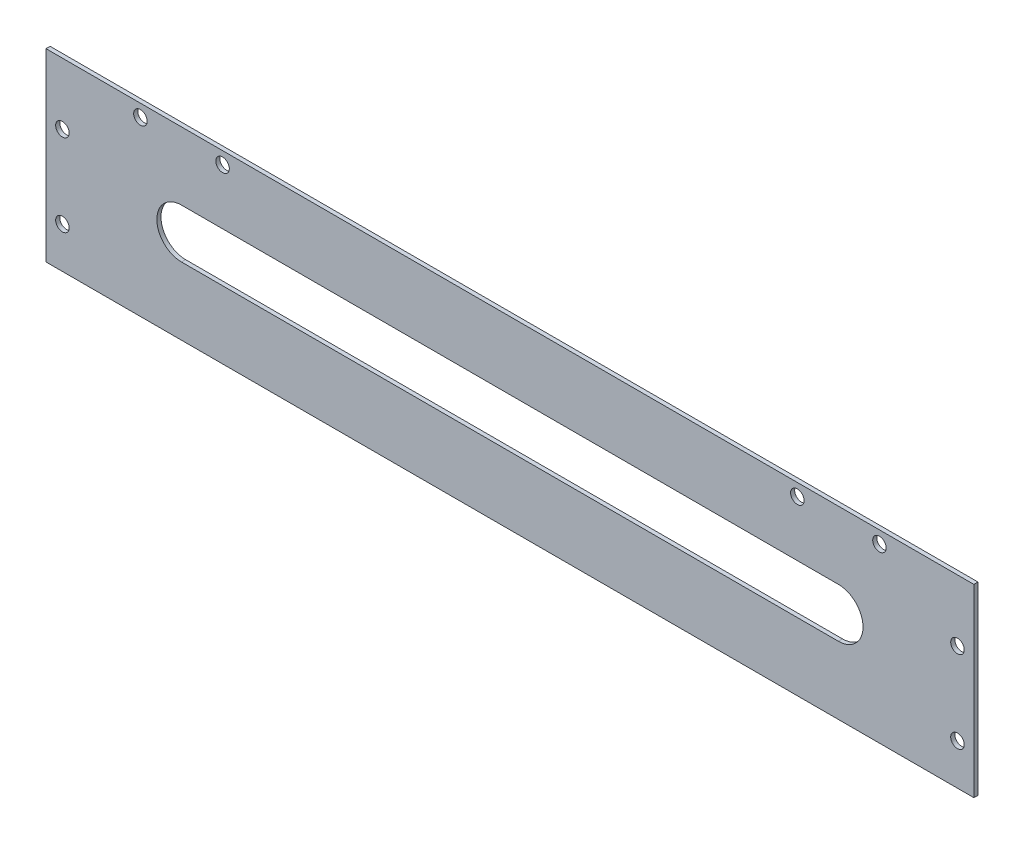
ISO-10303-21;
HEADER;
FILE_DESCRIPTION(('STEP AP214'),'2;1');
FILE_NAME('part.step','',(''),(''),'','','');
FILE_SCHEMA(('AUTOMOTIVE_DESIGN { 1 0 10303 214 1 1 1 1 }'));
ENDSEC;
DATA;
#1=APPLICATION_CONTEXT('core data for automotive mechanical design processes');
#2=APPLICATION_PROTOCOL_DEFINITION('international standard','automotive_design',2000,#1);
#3=PRODUCT_CONTEXT('',#1,'mechanical');
#4=PRODUCT('Part','Part','',(#3));
#5=PRODUCT_RELATED_PRODUCT_CATEGORY('part','',(#4));
#6=PRODUCT_DEFINITION_FORMATION('','',#4);
#7=PRODUCT_DEFINITION_CONTEXT('part definition',#1,'design');
#8=PRODUCT_DEFINITION('design','',#6,#7);
#9=PRODUCT_DEFINITION_SHAPE('','',#8);
#10=(LENGTH_UNIT() NAMED_UNIT(*) SI_UNIT(.MILLI.,.METRE.));
#11=(NAMED_UNIT(*) PLANE_ANGLE_UNIT() SI_UNIT($,.RADIAN.));
#12=(NAMED_UNIT(*) SI_UNIT($,.STERADIAN.) SOLID_ANGLE_UNIT());
#13=UNCERTAINTY_MEASURE_WITH_UNIT(LENGTH_MEASURE(1.E-05),#10,'distance_accuracy_value','');
#14=(GEOMETRIC_REPRESENTATION_CONTEXT(3) GLOBAL_UNCERTAINTY_ASSIGNED_CONTEXT((#13)) GLOBAL_UNIT_ASSIGNED_CONTEXT((#10,
#11,#12)) REPRESENTATION_CONTEXT('',''));
#15=CARTESIAN_POINT('',(0.,0.,0.));
#16=DIRECTION('',(0.,0.,1.));
#17=DIRECTION('',(1.,0.,0.));
#18=AXIS2_PLACEMENT_3D('',#15,#16,#17);
#19=CARTESIAN_POINT('',(113.,22.5,1.));
#20=DIRECTION('',(-1.,0.,0.));
#21=DIRECTION('',(0.,-1.,0.));
#22=AXIS2_PLACEMENT_3D('',#19,#20,#21);
#23=PLANE('',#22);
#24=DIRECTION('',(0.,1.,0.));
#25=VECTOR('',#24,1.);
#26=CARTESIAN_POINT('',(113.,22.5,0.));
#27=LINE('',#26,#25);
#28=CARTESIAN_POINT('',(113.,-22.5,0.));
#29=VERTEX_POINT('',#28);
#30=CARTESIAN_POINT('',(113.,22.5,0.));
#31=VERTEX_POINT('',#30);
#32=EDGE_CURVE('E137',#29,#31,#27,.T.);
#33=ORIENTED_EDGE('',*,*,#32,.T.);
#34=DIRECTION('',(0.,0.,-1.));
#35=VECTOR('',#34,1.);
#36=CARTESIAN_POINT('',(113.,22.5,1.));
#37=LINE('',#36,#35);
#38=CARTESIAN_POINT('',(113.,22.5,1.));
#39=VERTEX_POINT('',#38);
#40=EDGE_CURVE('E184',#39,#31,#37,.T.);
#41=ORIENTED_EDGE('',*,*,#40,.F.);
#42=DIRECTION('',(0.,1.,0.));
#43=VECTOR('',#42,1.);
#44=CARTESIAN_POINT('',(113.,22.5,1.));
#45=LINE('',#44,#43);
#46=CARTESIAN_POINT('',(113.,-22.5,1.));
#47=VERTEX_POINT('',#46);
#48=EDGE_CURVE('E158',#47,#39,#45,.T.);
#49=ORIENTED_EDGE('',*,*,#48,.F.);
#50=DIRECTION('',(0.,0.,-1.));
#51=VECTOR('',#50,1.);
#52=CARTESIAN_POINT('',(113.,-22.5,1.));
#53=LINE('',#52,#51);
#54=EDGE_CURVE('E168',#47,#29,#53,.T.);
#55=ORIENTED_EDGE('',*,*,#54,.T.);
#56=EDGE_LOOP('',(#33,#41,#49,#55));
#57=FACE_BOUND('',#56,.T.);
#58=ADVANCED_FACE('F41',(#57),#23,.F.);
#59=CARTESIAN_POINT('',(-113.,22.5,1.));
#60=DIRECTION('',(0.,-1.,0.));
#61=DIRECTION('',(0.,0.,-1.));
#62=AXIS2_PLACEMENT_3D('',#59,#60,#61);
#63=PLANE('',#62);
#64=DIRECTION('',(-1.,0.,0.));
#65=VECTOR('',#64,1.);
#66=CARTESIAN_POINT('',(-113.,22.5,0.));
#67=LINE('',#66,#65);
#68=CARTESIAN_POINT('',(-113.,22.5,0.));
#69=VERTEX_POINT('',#68);
#70=EDGE_CURVE('E171',#31,#69,#67,.T.);
#71=ORIENTED_EDGE('',*,*,#70,.T.);
#72=DIRECTION('',(0.,0.,-1.));
#73=VECTOR('',#72,1.);
#74=CARTESIAN_POINT('',(-113.,22.5,1.));
#75=LINE('',#74,#73);
#76=CARTESIAN_POINT('',(-113.,22.5,1.));
#77=VERTEX_POINT('',#76);
#78=EDGE_CURVE('E181',#77,#69,#75,.T.);
#79=ORIENTED_EDGE('',*,*,#78,.F.);
#80=DIRECTION('',(-1.,0.,0.));
#81=VECTOR('',#80,1.);
#82=CARTESIAN_POINT('',(-113.,22.5,1.));
#83=LINE('',#82,#81);
#84=EDGE_CURVE('E161',#39,#77,#83,.T.);
#85=ORIENTED_EDGE('',*,*,#84,.F.);
#86=ORIENTED_EDGE('',*,*,#40,.T.);
#87=EDGE_LOOP('',(#71,#79,#85,#86));
#88=FACE_BOUND('',#87,.T.);
#89=ADVANCED_FACE('F210',(#88),#63,.F.);
#90=CARTESIAN_POINT('',(-113.,22.5,1.));
#91=DIRECTION('',(1.,0.,0.));
#92=DIRECTION('',(0.,0.,-1.));
#93=AXIS2_PLACEMENT_3D('',#90,#91,#92);
#94=PLANE('',#93);
#95=DIRECTION('',(0.,-1.,0.));
#96=VECTOR('',#95,1.);
#97=CARTESIAN_POINT('',(-113.,22.5,0.));
#98=LINE('',#97,#96);
#99=CARTESIAN_POINT('',(-113.,-22.5,0.));
#100=VERTEX_POINT('',#99);
#101=EDGE_CURVE('E173',#69,#100,#98,.T.);
#102=ORIENTED_EDGE('',*,*,#101,.T.);
#103=DIRECTION('',(0.,0.,-1.));
#104=VECTOR('',#103,1.);
#105=CARTESIAN_POINT('',(-113.,-22.5,1.));
#106=LINE('',#105,#104);
#107=CARTESIAN_POINT('',(-113.,-22.5,1.));
#108=VERTEX_POINT('',#107);
#109=EDGE_CURVE('E178',#108,#100,#106,.T.);
#110=ORIENTED_EDGE('',*,*,#109,.F.);
#111=DIRECTION('',(0.,-1.,0.));
#112=VECTOR('',#111,1.);
#113=CARTESIAN_POINT('',(-113.,22.5,1.));
#114=LINE('',#113,#112);
#115=EDGE_CURVE('E164',#77,#108,#114,.T.);
#116=ORIENTED_EDGE('',*,*,#115,.F.);
#117=ORIENTED_EDGE('',*,*,#78,.T.);
#118=EDGE_LOOP('',(#102,#110,#116,#117));
#119=FACE_BOUND('',#118,.T.);
#120=ADVANCED_FACE('F215',(#119),#94,.F.);
#121=CARTESIAN_POINT('',(-113.,-22.5,1.));
#122=DIRECTION('',(0.,1.,0.));
#123=DIRECTION('',(0.,0.,1.));
#124=AXIS2_PLACEMENT_3D('',#121,#122,#123);
#125=PLANE('',#124);
#126=DIRECTION('',(1.,0.,0.));
#127=VECTOR('',#126,1.);
#128=CARTESIAN_POINT('',(-113.,-22.5,0.));
#129=LINE('',#128,#127);
#130=EDGE_CURVE('E162',#100,#29,#129,.T.);
#131=ORIENTED_EDGE('',*,*,#130,.T.);
#132=ORIENTED_EDGE('',*,*,#54,.F.);
#133=DIRECTION('',(1.,0.,0.));
#134=VECTOR('',#133,1.);
#135=CARTESIAN_POINT('',(-113.,-22.5,1.));
#136=LINE('',#135,#134);
#137=EDGE_CURVE('E166',#108,#47,#136,.T.);
#138=ORIENTED_EDGE('',*,*,#137,.F.);
#139=ORIENTED_EDGE('',*,*,#109,.T.);
#140=EDGE_LOOP('',(#131,#132,#138,#139));
#141=FACE_BOUND('',#140,.T.);
#142=ADVANCED_FACE('F230',(#141),#125,.F.);
#143=CARTESIAN_POINT('',(0.,0.,1.));
#144=DIRECTION('',(0.,0.,1.));
#145=DIRECTION('',(1.,0.,0.));
#146=AXIS2_PLACEMENT_3D('',#143,#144,#145);
#147=PLANE('',#146);
#148=CARTESIAN_POINT('',(-109.,7.50000000000001,1.));
#149=DIRECTION('',(0.,0.,1.));
#150=DIRECTION('',(-1.,0.,0.));
#151=AXIS2_PLACEMENT_3D('',#148,#149,#150);
#152=CIRCLE('',#151,1.65);
#153=CARTESIAN_POINT('',(-110.65,7.50000000000001,1.));
#154=VERTEX_POINT('',#153);
#155=EDGE_CURVE('E354',#154,#154,#152,.T.);
#156=ORIENTED_EDGE('',*,*,#155,.F.);
#157=EDGE_LOOP('',(#156));
#158=FACE_BOUND('',#157,.T.);
#159=CARTESIAN_POINT('',(-109.,-12.5,1.));
#160=DIRECTION('',(0.,0.,1.));
#161=DIRECTION('',(-1.,0.,0.));
#162=AXIS2_PLACEMENT_3D('',#159,#160,#161);
#163=CIRCLE('',#162,1.65);
#164=CARTESIAN_POINT('',(-110.65,-12.5,1.));
#165=VERTEX_POINT('',#164);
#166=EDGE_CURVE('E358',#165,#165,#163,.T.);
#167=ORIENTED_EDGE('',*,*,#166,.F.);
#168=EDGE_LOOP('',(#167));
#169=FACE_BOUND('',#168,.T.);
#170=CARTESIAN_POINT('',(109.,-12.5,1.));
#171=DIRECTION('',(0.,0.,1.));
#172=DIRECTION('',(1.,0.,0.));
#173=AXIS2_PLACEMENT_3D('',#170,#171,#172);
#174=CIRCLE('',#173,1.65);
#175=CARTESIAN_POINT('',(110.65,-12.5,1.));
#176=VERTEX_POINT('',#175);
#177=EDGE_CURVE('E368',#176,#176,#174,.T.);
#178=ORIENTED_EDGE('',*,*,#177,.F.);
#179=EDGE_LOOP('',(#178));
#180=FACE_BOUND('',#179,.T.);
#181=CARTESIAN_POINT('',(109.,7.50000000000004,1.));
#182=DIRECTION('',(0.,0.,1.));
#183=DIRECTION('',(1.,0.,0.));
#184=AXIS2_PLACEMENT_3D('',#181,#182,#183);
#185=CIRCLE('',#184,1.65);
#186=CARTESIAN_POINT('',(110.65,7.50000000000004,1.));
#187=VERTEX_POINT('',#186);
#188=EDGE_CURVE('E366',#187,#187,#185,.T.);
#189=ORIENTED_EDGE('',*,*,#188,.F.);
#190=EDGE_LOOP('',(#189));
#191=FACE_BOUND('',#190,.T.);
#192=CARTESIAN_POINT('',(-80.,0.,1.));
#193=DIRECTION('',(0.,0.,1.));
#194=DIRECTION('',(1.,0.,0.));
#195=AXIS2_PLACEMENT_3D('',#192,#193,#194);
#196=CIRCLE('',#195,6.00000000000003);
#197=CARTESIAN_POINT('',(-80.,6.00000000000003,1.));
#198=VERTEX_POINT('',#197);
#199=CARTESIAN_POINT('',(-80.,-6.00000000000003,1.));
#200=VERTEX_POINT('',#199);
#201=EDGE_CURVE('E55',#198,#200,#196,.T.);
#202=ORIENTED_EDGE('',*,*,#201,.F.);
#203=DIRECTION('',(-1.,0.,0.));
#204=VECTOR('',#203,1.);
#205=CARTESIAN_POINT('',(-80.,6.00000000000003,1.));
#206=LINE('',#205,#204);
#207=CARTESIAN_POINT('',(80.,6.00000000000006,1.));
#208=VERTEX_POINT('',#207);
#209=EDGE_CURVE('E124',#208,#198,#206,.T.);
#210=ORIENTED_EDGE('',*,*,#209,.F.);
#211=CARTESIAN_POINT('',(80.,0.,1.));
#212=DIRECTION('',(0.,0.,1.));
#213=DIRECTION('',(1.,0.,0.));
#214=AXIS2_PLACEMENT_3D('',#211,#212,#213);
#215=CIRCLE('',#214,6.00000000000003);
#216=CARTESIAN_POINT('',(80.,-6.,1.));
#217=VERTEX_POINT('',#216);
#218=EDGE_CURVE('E108',#217,#208,#215,.T.);
#219=ORIENTED_EDGE('',*,*,#218,.F.);
#220=DIRECTION('',(1.,0.,0.));
#221=VECTOR('',#220,1.);
#222=CARTESIAN_POINT('',(-80.,-6.00000000000003,1.));
#223=LINE('',#222,#221);
#224=EDGE_CURVE('E117',#200,#217,#223,.T.);
#225=ORIENTED_EDGE('',*,*,#224,.F.);
#226=EDGE_LOOP('',(#202,#210,#219,#225));
#227=FACE_BOUND('',#226,.T.);
#228=CARTESIAN_POINT('',(90.,19.5,1.));
#229=DIRECTION('',(0.,0.,1.));
#230=DIRECTION('',(1.,0.,0.));
#231=AXIS2_PLACEMENT_3D('',#228,#229,#230);
#232=CIRCLE('',#231,1.65);
#233=CARTESIAN_POINT('',(91.65,19.5,1.));
#234=VERTEX_POINT('',#233);
#235=EDGE_CURVE('E138',#234,#234,#232,.T.);
#236=ORIENTED_EDGE('',*,*,#235,.F.);
#237=EDGE_LOOP('',(#236));
#238=FACE_BOUND('',#237,.T.);
#239=CARTESIAN_POINT('',(70.,19.5,1.));
#240=DIRECTION('',(0.,0.,1.));
#241=DIRECTION('',(1.,0.,0.));
#242=AXIS2_PLACEMENT_3D('',#239,#240,#241);
#243=CIRCLE('',#242,1.65);
#244=CARTESIAN_POINT('',(71.65,19.5,1.));
#245=VERTEX_POINT('',#244);
#246=EDGE_CURVE('E141',#245,#245,#243,.T.);
#247=ORIENTED_EDGE('',*,*,#246,.F.);
#248=EDGE_LOOP('',(#247));
#249=FACE_BOUND('',#248,.T.);
#250=CARTESIAN_POINT('',(-70.,19.5,1.));
#251=DIRECTION('',(0.,0.,1.));
#252=DIRECTION('',(-1.,0.,0.));
#253=AXIS2_PLACEMENT_3D('',#250,#251,#252);
#254=CIRCLE('',#253,1.65);
#255=CARTESIAN_POINT('',(-71.65,19.5,1.));
#256=VERTEX_POINT('',#255);
#257=EDGE_CURVE('E147',#256,#256,#254,.T.);
#258=ORIENTED_EDGE('',*,*,#257,.F.);
#259=EDGE_LOOP('',(#258));
#260=FACE_BOUND('',#259,.T.);
#261=CARTESIAN_POINT('',(-90.,19.5,1.));
#262=DIRECTION('',(0.,0.,1.));
#263=DIRECTION('',(-1.,0.,0.));
#264=AXIS2_PLACEMENT_3D('',#261,#262,#263);
#265=CIRCLE('',#264,1.65);
#266=CARTESIAN_POINT('',(-91.65,19.5,1.));
#267=VERTEX_POINT('',#266);
#268=EDGE_CURVE('E153',#267,#267,#265,.T.);
#269=ORIENTED_EDGE('',*,*,#268,.F.);
#270=EDGE_LOOP('',(#269));
#271=FACE_BOUND('',#270,.T.);
#272=ORIENTED_EDGE('',*,*,#48,.T.);
#273=ORIENTED_EDGE('',*,*,#84,.T.);
#274=ORIENTED_EDGE('',*,*,#115,.T.);
#275=ORIENTED_EDGE('',*,*,#137,.T.);
#276=EDGE_LOOP('',(#272,#273,#274,#275));
#277=FACE_BOUND('',#276,.T.);
#278=ADVANCED_FACE('F121',(#158,#169,#180,#191,#227,#238,#249,#260,#271,#277),#147,.T.);
#279=CARTESIAN_POINT('',(0.,0.,0.));
#280=DIRECTION('',(0.,0.,1.));
#281=DIRECTION('',(1.,0.,0.));
#282=AXIS2_PLACEMENT_3D('',#279,#280,#281);
#283=PLANE('',#282);
#284=CARTESIAN_POINT('',(-109.,7.50000000000001,0.));
#285=DIRECTION('',(0.,0.,1.));
#286=DIRECTION('',(-1.,0.,0.));
#287=AXIS2_PLACEMENT_3D('',#284,#285,#286);
#288=CIRCLE('',#287,1.65);
#289=CARTESIAN_POINT('',(-110.65,7.50000000000001,0.));
#290=VERTEX_POINT('',#289);
#291=EDGE_CURVE('E351',#290,#290,#288,.T.);
#292=ORIENTED_EDGE('',*,*,#291,.T.);
#293=EDGE_LOOP('',(#292));
#294=FACE_BOUND('',#293,.T.);
#295=CARTESIAN_POINT('',(-109.,-12.5,0.));
#296=DIRECTION('',(0.,0.,1.));
#297=DIRECTION('',(-1.,0.,0.));
#298=AXIS2_PLACEMENT_3D('',#295,#296,#297);
#299=CIRCLE('',#298,1.65);
#300=CARTESIAN_POINT('',(-110.65,-12.5,0.));
#301=VERTEX_POINT('',#300);
#302=EDGE_CURVE('E355',#301,#301,#299,.T.);
#303=ORIENTED_EDGE('',*,*,#302,.T.);
#304=EDGE_LOOP('',(#303));
#305=FACE_BOUND('',#304,.T.);
#306=CARTESIAN_POINT('',(109.,-12.5,0.));
#307=DIRECTION('',(0.,0.,1.));
#308=DIRECTION('',(1.,0.,0.));
#309=AXIS2_PLACEMENT_3D('',#306,#307,#308);
#310=CIRCLE('',#309,1.65);
#311=CARTESIAN_POINT('',(110.65,-12.5,0.));
#312=VERTEX_POINT('',#311);
#313=EDGE_CURVE('E372',#312,#312,#310,.T.);
#314=ORIENTED_EDGE('',*,*,#313,.T.);
#315=EDGE_LOOP('',(#314));
#316=FACE_BOUND('',#315,.T.);
#317=CARTESIAN_POINT('',(109.,7.50000000000004,0.));
#318=DIRECTION('',(0.,0.,1.));
#319=DIRECTION('',(1.,0.,0.));
#320=AXIS2_PLACEMENT_3D('',#317,#318,#319);
#321=CIRCLE('',#320,1.65);
#322=CARTESIAN_POINT('',(110.65,7.50000000000004,0.));
#323=VERTEX_POINT('',#322);
#324=EDGE_CURVE('E363',#323,#323,#321,.T.);
#325=ORIENTED_EDGE('',*,*,#324,.T.);
#326=EDGE_LOOP('',(#325));
#327=FACE_BOUND('',#326,.T.);
#328=DIRECTION('',(-1.,0.,0.));
#329=VECTOR('',#328,1.);
#330=CARTESIAN_POINT('',(0.,6.00000000000004,0.));
#331=LINE('',#330,#329);
#332=CARTESIAN_POINT('',(80.,6.00000000000006,0.));
#333=VERTEX_POINT('',#332);
#334=CARTESIAN_POINT('',(-80.,6.00000000000003,0.));
#335=VERTEX_POINT('',#334);
#336=EDGE_CURVE('E48',#333,#335,#331,.T.);
#337=ORIENTED_EDGE('',*,*,#336,.T.);
#338=CARTESIAN_POINT('',(-80.,0.,0.));
#339=DIRECTION('',(0.,0.,1.));
#340=DIRECTION('',(1.,0.,0.));
#341=AXIS2_PLACEMENT_3D('',#338,#339,#340);
#342=CIRCLE('',#341,6.00000000000003);
#343=CARTESIAN_POINT('',(-80.,-6.00000000000003,0.));
#344=VERTEX_POINT('',#343);
#345=EDGE_CURVE('E11',#335,#344,#342,.T.);
#346=ORIENTED_EDGE('',*,*,#345,.T.);
#347=DIRECTION('',(1.,0.,0.));
#348=VECTOR('',#347,1.);
#349=CARTESIAN_POINT('',(0.,-6.00000000000002,0.));
#350=LINE('',#349,#348);
#351=CARTESIAN_POINT('',(80.,-6.,0.));
#352=VERTEX_POINT('',#351);
#353=EDGE_CURVE('E187',#344,#352,#350,.T.);
#354=ORIENTED_EDGE('',*,*,#353,.T.);
#355=CARTESIAN_POINT('',(80.,0.,0.));
#356=DIRECTION('',(0.,0.,1.));
#357=DIRECTION('',(1.,0.,0.));
#358=AXIS2_PLACEMENT_3D('',#355,#356,#357);
#359=CIRCLE('',#358,6.00000000000003);
#360=EDGE_CURVE('E111',#352,#333,#359,.T.);
#361=ORIENTED_EDGE('',*,*,#360,.T.);
#362=EDGE_LOOP('',(#337,#346,#354,#361));
#363=FACE_BOUND('',#362,.T.);
#364=CARTESIAN_POINT('',(90.,19.5,0.));
#365=DIRECTION('',(0.,0.,1.));
#366=DIRECTION('',(1.,0.,0.));
#367=AXIS2_PLACEMENT_3D('',#364,#365,#366);
#368=CIRCLE('',#367,1.65);
#369=CARTESIAN_POINT('',(91.65,19.5,0.));
#370=VERTEX_POINT('',#369);
#371=EDGE_CURVE('E134',#370,#370,#368,.T.);
#372=ORIENTED_EDGE('',*,*,#371,.T.);
#373=EDGE_LOOP('',(#372));
#374=FACE_BOUND('',#373,.T.);
#375=CARTESIAN_POINT('',(70.,19.5,0.));
#376=DIRECTION('',(0.,0.,1.));
#377=DIRECTION('',(1.,0.,0.));
#378=AXIS2_PLACEMENT_3D('',#375,#376,#377);
#379=CIRCLE('',#378,1.65);
#380=CARTESIAN_POINT('',(71.65,19.5,0.));
#381=VERTEX_POINT('',#380);
#382=EDGE_CURVE('E144',#381,#381,#379,.T.);
#383=ORIENTED_EDGE('',*,*,#382,.T.);
#384=EDGE_LOOP('',(#383));
#385=FACE_BOUND('',#384,.T.);
#386=CARTESIAN_POINT('',(-70.,19.5,0.));
#387=DIRECTION('',(0.,0.,1.));
#388=DIRECTION('',(-1.,0.,0.));
#389=AXIS2_PLACEMENT_3D('',#386,#387,#388);
#390=CIRCLE('',#389,1.65);
#391=CARTESIAN_POINT('',(-71.65,19.5,0.));
#392=VERTEX_POINT('',#391);
#393=EDGE_CURVE('E150',#392,#392,#390,.T.);
#394=ORIENTED_EDGE('',*,*,#393,.T.);
#395=EDGE_LOOP('',(#394));
#396=FACE_BOUND('',#395,.T.);
#397=CARTESIAN_POINT('',(-90.,19.5,0.));
#398=DIRECTION('',(0.,0.,1.));
#399=DIRECTION('',(-1.,0.,0.));
#400=AXIS2_PLACEMENT_3D('',#397,#398,#399);
#401=CIRCLE('',#400,1.65);
#402=CARTESIAN_POINT('',(-91.65,19.5,0.));
#403=VERTEX_POINT('',#402);
#404=EDGE_CURVE('E131',#403,#403,#401,.T.);
#405=ORIENTED_EDGE('',*,*,#404,.T.);
#406=EDGE_LOOP('',(#405));
#407=FACE_BOUND('',#406,.T.);
#408=ORIENTED_EDGE('',*,*,#32,.F.);
#409=ORIENTED_EDGE('',*,*,#130,.F.);
#410=ORIENTED_EDGE('',*,*,#101,.F.);
#411=ORIENTED_EDGE('',*,*,#70,.F.);
#412=EDGE_LOOP('',(#408,#409,#410,#411));
#413=FACE_BOUND('',#412,.T.);
#414=ADVANCED_FACE('F191',(#294,#305,#316,#327,#363,#374,#385,#396,#407,#413),#283,.F.);
#415=CARTESIAN_POINT('',(-90.,19.5,0.));
#416=DIRECTION('',(0.,0.,1.));
#417=DIRECTION('',(1.,0.,0.));
#418=AXIS2_PLACEMENT_3D('',#415,#416,#417);
#419=CYLINDRICAL_SURFACE('',#418,1.65);
#420=ORIENTED_EDGE('',*,*,#404,.F.);
#421=EDGE_LOOP('',(#420));
#422=FACE_BOUND('',#421,.T.);
#423=ORIENTED_EDGE('',*,*,#268,.T.);
#424=EDGE_LOOP('',(#423));
#425=FACE_BOUND('',#424,.T.);
#426=ADVANCED_FACE('F241',(#422,#425),#419,.F.);
#427=CARTESIAN_POINT('',(-70.,19.5,0.));
#428=DIRECTION('',(0.,0.,1.));
#429=DIRECTION('',(1.,0.,0.));
#430=AXIS2_PLACEMENT_3D('',#427,#428,#429);
#431=CYLINDRICAL_SURFACE('',#430,1.65);
#432=ORIENTED_EDGE('',*,*,#393,.F.);
#433=EDGE_LOOP('',(#432));
#434=FACE_BOUND('',#433,.T.);
#435=ORIENTED_EDGE('',*,*,#257,.T.);
#436=EDGE_LOOP('',(#435));
#437=FACE_BOUND('',#436,.T.);
#438=ADVANCED_FACE('F248',(#434,#437),#431,.F.);
#439=CARTESIAN_POINT('',(70.,19.5,0.));
#440=DIRECTION('',(0.,0.,1.));
#441=DIRECTION('',(1.,0.,0.));
#442=AXIS2_PLACEMENT_3D('',#439,#440,#441);
#443=CYLINDRICAL_SURFACE('',#442,1.65);
#444=ORIENTED_EDGE('',*,*,#382,.F.);
#445=EDGE_LOOP('',(#444));
#446=FACE_BOUND('',#445,.T.);
#447=ORIENTED_EDGE('',*,*,#246,.T.);
#448=EDGE_LOOP('',(#447));
#449=FACE_BOUND('',#448,.T.);
#450=ADVANCED_FACE('F205',(#446,#449),#443,.F.);
#451=CARTESIAN_POINT('',(90.,19.5,0.));
#452=DIRECTION('',(0.,0.,1.));
#453=DIRECTION('',(1.,0.,0.));
#454=AXIS2_PLACEMENT_3D('',#451,#452,#453);
#455=CYLINDRICAL_SURFACE('',#454,1.65);
#456=ORIENTED_EDGE('',*,*,#371,.F.);
#457=EDGE_LOOP('',(#456));
#458=FACE_BOUND('',#457,.T.);
#459=ORIENTED_EDGE('',*,*,#235,.T.);
#460=EDGE_LOOP('',(#459));
#461=FACE_BOUND('',#460,.T.);
#462=ADVANCED_FACE('F198',(#458,#461),#455,.F.);
#463=CARTESIAN_POINT('',(-80.,0.,-9.));
#464=DIRECTION('',(0.,0.,1.));
#465=DIRECTION('',(1.,0.,0.));
#466=AXIS2_PLACEMENT_3D('',#463,#464,#465);
#467=CYLINDRICAL_SURFACE('',#466,6.00000000000003);
#468=DIRECTION('',(0.,0.,1.));
#469=VECTOR('',#468,1.);
#470=CARTESIAN_POINT('',(-80.,6.00000000000003,-9.));
#471=LINE('',#470,#469);
#472=EDGE_CURVE('E129',#335,#198,#471,.T.);
#473=ORIENTED_EDGE('',*,*,#472,.T.);
#474=ORIENTED_EDGE('',*,*,#201,.T.);
#475=DIRECTION('',(0.,0.,1.));
#476=VECTOR('',#475,1.);
#477=CARTESIAN_POINT('',(-80.,-6.00000000000003,-9.));
#478=LINE('',#477,#476);
#479=EDGE_CURVE('E114',#344,#200,#478,.T.);
#480=ORIENTED_EDGE('',*,*,#479,.F.);
#481=ORIENTED_EDGE('',*,*,#345,.F.);
#482=EDGE_LOOP('',(#473,#474,#480,#481));
#483=FACE_BOUND('',#482,.T.);
#484=ADVANCED_FACE('F196',(#483),#467,.F.);
#485=CARTESIAN_POINT('',(-80.,6.00000000000003,-9.));
#486=DIRECTION('',(0.,1.,0.));
#487=DIRECTION('',(-1.,0.,0.));
#488=AXIS2_PLACEMENT_3D('',#485,#486,#487);
#489=PLANE('',#488);
#490=DIRECTION('',(0.,0.,1.));
#491=VECTOR('',#490,1.);
#492=CARTESIAN_POINT('',(80.,6.00000000000006,-9.));
#493=LINE('',#492,#491);
#494=EDGE_CURVE('E113',#333,#208,#493,.T.);
#495=ORIENTED_EDGE('',*,*,#494,.T.);
#496=ORIENTED_EDGE('',*,*,#209,.T.);
#497=ORIENTED_EDGE('',*,*,#472,.F.);
#498=ORIENTED_EDGE('',*,*,#336,.F.);
#499=EDGE_LOOP('',(#495,#496,#497,#498));
#500=FACE_BOUND('',#499,.T.);
#501=ADVANCED_FACE('F195',(#500),#489,.F.);
#502=CARTESIAN_POINT('',(80.,0.,-9.));
#503=DIRECTION('',(0.,0.,1.));
#504=DIRECTION('',(1.,0.,0.));
#505=AXIS2_PLACEMENT_3D('',#502,#503,#504);
#506=CYLINDRICAL_SURFACE('',#505,6.00000000000003);
#507=DIRECTION('',(0.,0.,1.));
#508=VECTOR('',#507,1.);
#509=CARTESIAN_POINT('',(80.,-6.,-9.));
#510=LINE('',#509,#508);
#511=EDGE_CURVE('E63',#352,#217,#510,.T.);
#512=ORIENTED_EDGE('',*,*,#511,.T.);
#513=ORIENTED_EDGE('',*,*,#218,.T.);
#514=ORIENTED_EDGE('',*,*,#494,.F.);
#515=ORIENTED_EDGE('',*,*,#360,.F.);
#516=EDGE_LOOP('',(#512,#513,#514,#515));
#517=FACE_BOUND('',#516,.T.);
#518=ADVANCED_FACE('F105',(#517),#506,.F.);
#519=CARTESIAN_POINT('',(-80.,-6.00000000000003,-9.));
#520=DIRECTION('',(0.,-1.,0.));
#521=DIRECTION('',(1.,0.,0.));
#522=AXIS2_PLACEMENT_3D('',#519,#520,#521);
#523=PLANE('',#522);
#524=ORIENTED_EDGE('',*,*,#479,.T.);
#525=ORIENTED_EDGE('',*,*,#224,.T.);
#526=ORIENTED_EDGE('',*,*,#511,.F.);
#527=ORIENTED_EDGE('',*,*,#353,.F.);
#528=EDGE_LOOP('',(#524,#525,#526,#527));
#529=FACE_BOUND('',#528,.T.);
#530=ADVANCED_FACE('F118',(#529),#523,.F.);
#531=CARTESIAN_POINT('',(109.,7.50000000000004,0.));
#532=DIRECTION('',(0.,0.,1.));
#533=DIRECTION('',(1.,0.,0.));
#534=AXIS2_PLACEMENT_3D('',#531,#532,#533);
#535=CYLINDRICAL_SURFACE('',#534,1.65);
#536=ORIENTED_EDGE('',*,*,#324,.F.);
#537=EDGE_LOOP('',(#536));
#538=FACE_BOUND('',#537,.T.);
#539=ORIENTED_EDGE('',*,*,#188,.T.);
#540=EDGE_LOOP('',(#539));
#541=FACE_BOUND('',#540,.T.);
#542=ADVANCED_FACE('F307',(#538,#541),#535,.F.);
#543=CARTESIAN_POINT('',(109.,-12.5,0.));
#544=DIRECTION('',(0.,0.,1.));
#545=DIRECTION('',(1.,0.,0.));
#546=AXIS2_PLACEMENT_3D('',#543,#544,#545);
#547=CYLINDRICAL_SURFACE('',#546,1.65);
#548=ORIENTED_EDGE('',*,*,#313,.F.);
#549=EDGE_LOOP('',(#548));
#550=FACE_BOUND('',#549,.T.);
#551=ORIENTED_EDGE('',*,*,#177,.T.);
#552=EDGE_LOOP('',(#551));
#553=FACE_BOUND('',#552,.T.);
#554=ADVANCED_FACE('F315',(#550,#553),#547,.F.);
#555=CARTESIAN_POINT('',(-109.,-12.5,0.));
#556=DIRECTION('',(0.,0.,1.));
#557=DIRECTION('',(1.,0.,0.));
#558=AXIS2_PLACEMENT_3D('',#555,#556,#557);
#559=CYLINDRICAL_SURFACE('',#558,1.65);
#560=ORIENTED_EDGE('',*,*,#302,.F.);
#561=EDGE_LOOP('',(#560));
#562=FACE_BOUND('',#561,.T.);
#563=ORIENTED_EDGE('',*,*,#166,.T.);
#564=EDGE_LOOP('',(#563));
#565=FACE_BOUND('',#564,.T.);
#566=ADVANCED_FACE('F325',(#562,#565),#559,.F.);
#567=CARTESIAN_POINT('',(-109.,7.50000000000001,0.));
#568=DIRECTION('',(0.,0.,1.));
#569=DIRECTION('',(1.,0.,0.));
#570=AXIS2_PLACEMENT_3D('',#567,#568,#569);
#571=CYLINDRICAL_SURFACE('',#570,1.65);
#572=ORIENTED_EDGE('',*,*,#291,.F.);
#573=EDGE_LOOP('',(#572));
#574=FACE_BOUND('',#573,.T.);
#575=ORIENTED_EDGE('',*,*,#155,.T.);
#576=EDGE_LOOP('',(#575));
#577=FACE_BOUND('',#576,.T.);
#578=ADVANCED_FACE('F335',(#574,#577),#571,.F.);
#579=CLOSED_SHELL('',(#58,#89,#120,#142,#278,#414,#426,#438,#450,#462,#484,#501,#518,#530,#542,
#554,#566,#578));
#580=MANIFOLD_SOLID_BREP('B2',#579);
#581=ADVANCED_BREP_SHAPE_REPRESENTATION('',(#18,#580),#14);
#582=SHAPE_DEFINITION_REPRESENTATION(#9,#581);
ENDSEC;
END-ISO-10303-21;
